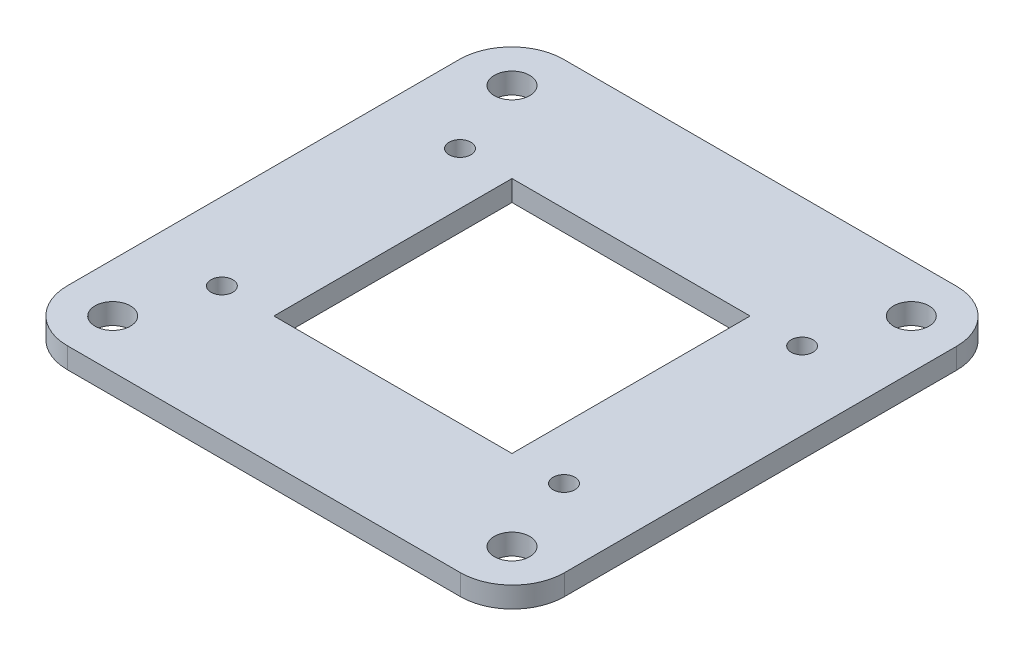
ISO-10303-21;
HEADER;
FILE_DESCRIPTION(('STEP AP214'),'2;1');
FILE_NAME('part.step','',(''),(''),'','','');
FILE_SCHEMA(('AUTOMOTIVE_DESIGN { 1 0 10303 214 1 1 1 1 }'));
ENDSEC;
DATA;
#1=APPLICATION_CONTEXT('core data for automotive mechanical design processes');
#2=APPLICATION_PROTOCOL_DEFINITION('international standard','automotive_design',2000,#1);
#3=PRODUCT_CONTEXT('',#1,'mechanical');
#4=PRODUCT('Part','Part','',(#3));
#5=PRODUCT_RELATED_PRODUCT_CATEGORY('part','',(#4));
#6=PRODUCT_DEFINITION_FORMATION('','',#4);
#7=PRODUCT_DEFINITION_CONTEXT('part definition',#1,'design');
#8=PRODUCT_DEFINITION('design','',#6,#7);
#9=PRODUCT_DEFINITION_SHAPE('','',#8);
#10=(LENGTH_UNIT() NAMED_UNIT(*) SI_UNIT(.MILLI.,.METRE.));
#11=(NAMED_UNIT(*) PLANE_ANGLE_UNIT() SI_UNIT($,.RADIAN.));
#12=(NAMED_UNIT(*) SI_UNIT($,.STERADIAN.) SOLID_ANGLE_UNIT());
#13=UNCERTAINTY_MEASURE_WITH_UNIT(LENGTH_MEASURE(1.E-05),#10,'distance_accuracy_value','');
#14=(GEOMETRIC_REPRESENTATION_CONTEXT(3) GLOBAL_UNCERTAINTY_ASSIGNED_CONTEXT((#13)) GLOBAL_UNIT_ASSIGNED_CONTEXT((#10,
#11,#12)) REPRESENTATION_CONTEXT('',''));
#15=CARTESIAN_POINT('',(0.,0.,0.));
#16=DIRECTION('',(0.,0.,1.));
#17=DIRECTION('',(1.,0.,0.));
#18=AXIS2_PLACEMENT_3D('',#15,#16,#17);
#19=CARTESIAN_POINT('',(0.,2.,-23.8566541265612));
#20=DIRECTION('',(0.,0.,-1.));
#21=DIRECTION('',(-1.,0.,0.));
#22=AXIS2_PLACEMENT_3D('',#19,#20,#21);
#23=PLANE('',#22);
#24=DIRECTION('',(1.,0.,0.));
#25=VECTOR('',#24,1.);
#26=CARTESIAN_POINT('',(0.,0.,-23.8566541265612));
#27=LINE('',#26,#25);
#28=CARTESIAN_POINT('',(-18.9,0.,-23.8566541265612));
#29=VERTEX_POINT('',#28);
#30=CARTESIAN_POINT('',(18.9,0.,-23.8566541265612));
#31=VERTEX_POINT('',#30);
#32=EDGE_CURVE('E223',#29,#31,#27,.T.);
#33=ORIENTED_EDGE('',*,*,#32,.F.);
#34=DIRECTION('',(0.,-1.,0.));
#35=VECTOR('',#34,1.);
#36=CARTESIAN_POINT('',(-18.9,2.,-23.8566541265612));
#37=LINE('',#36,#35);
#38=CARTESIAN_POINT('',(-18.9,2.,-23.8566541265612));
#39=VERTEX_POINT('',#38);
#40=EDGE_CURVE('E11',#39,#29,#37,.T.);
#41=ORIENTED_EDGE('',*,*,#40,.F.);
#42=DIRECTION('',(1.,0.,0.));
#43=VECTOR('',#42,1.);
#44=CARTESIAN_POINT('',(0.,2.,-23.8566541265612));
#45=LINE('',#44,#43);
#46=CARTESIAN_POINT('',(18.9,2.,-23.8566541265612));
#47=VERTEX_POINT('',#46);
#48=EDGE_CURVE('E322',#39,#47,#45,.T.);
#49=ORIENTED_EDGE('',*,*,#48,.T.);
#50=DIRECTION('',(0.,-1.,0.));
#51=VECTOR('',#50,1.);
#52=CARTESIAN_POINT('',(18.9,2.,-23.8566541265612));
#53=LINE('',#52,#51);
#54=EDGE_CURVE('E111',#47,#31,#53,.T.);
#55=ORIENTED_EDGE('',*,*,#54,.T.);
#56=EDGE_LOOP('',(#33,#41,#49,#55));
#57=FACE_BOUND('',#56,.T.);
#58=ADVANCED_FACE('F45',(#57),#23,.T.);
#59=CARTESIAN_POINT('',(-18.9,2.,-18.8566541265612));
#60=DIRECTION('',(0.,-1.,0.));
#61=DIRECTION('',(0.,0.,-1.));
#62=AXIS2_PLACEMENT_3D('',#59,#60,#61);
#63=CYLINDRICAL_SURFACE('',#62,5.);
#64=CARTESIAN_POINT('',(-18.9,0.,-18.8566541265612));
#65=DIRECTION('',(0.,1.,0.));
#66=DIRECTION('',(0.,0.,1.));
#67=AXIS2_PLACEMENT_3D('',#64,#65,#66);
#68=CIRCLE('',#67,5.);
#69=CARTESIAN_POINT('',(-23.9,0.,-18.8566541265612));
#70=VERTEX_POINT('',#69);
#71=EDGE_CURVE('E227',#29,#70,#68,.T.);
#72=ORIENTED_EDGE('',*,*,#71,.T.);
#73=DIRECTION('',(0.,-1.,0.));
#74=VECTOR('',#73,1.);
#75=CARTESIAN_POINT('',(-23.9,2.,-18.8566541265612));
#76=LINE('',#75,#74);
#77=CARTESIAN_POINT('',(-23.9,2.,-18.8566541265612));
#78=VERTEX_POINT('',#77);
#79=EDGE_CURVE('E56',#78,#70,#76,.T.);
#80=ORIENTED_EDGE('',*,*,#79,.F.);
#81=CARTESIAN_POINT('',(-18.9,2.,-18.8566541265612));
#82=DIRECTION('',(0.,1.,0.));
#83=DIRECTION('',(0.,0.,1.));
#84=AXIS2_PLACEMENT_3D('',#81,#82,#83);
#85=CIRCLE('',#84,5.);
#86=EDGE_CURVE('E325',#39,#78,#85,.T.);
#87=ORIENTED_EDGE('',*,*,#86,.F.);
#88=ORIENTED_EDGE('',*,*,#40,.T.);
#89=EDGE_LOOP('',(#72,#80,#87,#88));
#90=FACE_BOUND('',#89,.T.);
#91=ADVANCED_FACE('F359',(#90),#63,.T.);
#92=CARTESIAN_POINT('',(-23.9,2.,0.));
#93=DIRECTION('',(-1.,0.,0.));
#94=DIRECTION('',(0.,0.,1.));
#95=AXIS2_PLACEMENT_3D('',#92,#93,#94);
#96=PLANE('',#95);
#97=DIRECTION('',(0.,0.,-1.));
#98=VECTOR('',#97,1.);
#99=CARTESIAN_POINT('',(-23.9,0.,0.));
#100=LINE('',#99,#98);
#101=CARTESIAN_POINT('',(-23.9,0.,18.8566541265612));
#102=VERTEX_POINT('',#101);
#103=EDGE_CURVE('E231',#102,#70,#100,.T.);
#104=ORIENTED_EDGE('',*,*,#103,.F.);
#105=DIRECTION('',(0.,-1.,0.));
#106=VECTOR('',#105,1.);
#107=CARTESIAN_POINT('',(-23.9,2.,18.8566541265612));
#108=LINE('',#107,#106);
#109=CARTESIAN_POINT('',(-23.9,2.,18.8566541265612));
#110=VERTEX_POINT('',#109);
#111=EDGE_CURVE('E261',#110,#102,#108,.T.);
#112=ORIENTED_EDGE('',*,*,#111,.F.);
#113=DIRECTION('',(0.,0.,-1.));
#114=VECTOR('',#113,1.);
#115=CARTESIAN_POINT('',(-23.9,2.,0.));
#116=LINE('',#115,#114);
#117=EDGE_CURVE('E328',#110,#78,#116,.T.);
#118=ORIENTED_EDGE('',*,*,#117,.T.);
#119=ORIENTED_EDGE('',*,*,#79,.T.);
#120=EDGE_LOOP('',(#104,#112,#118,#119));
#121=FACE_BOUND('',#120,.T.);
#122=ADVANCED_FACE('F344',(#121),#96,.T.);
#123=CARTESIAN_POINT('',(-18.9,2.,18.8566541265613));
#124=DIRECTION('',(0.,-1.,0.));
#125=DIRECTION('',(0.,0.,-1.));
#126=AXIS2_PLACEMENT_3D('',#123,#124,#125);
#127=CYLINDRICAL_SURFACE('',#126,5.);
#128=CARTESIAN_POINT('',(-18.9,0.,18.8566541265613));
#129=DIRECTION('',(0.,1.,0.));
#130=DIRECTION('',(0.,0.,1.));
#131=AXIS2_PLACEMENT_3D('',#128,#129,#130);
#132=CIRCLE('',#131,5.);
#133=CARTESIAN_POINT('',(-18.9,0.,23.8566541265613));
#134=VERTEX_POINT('',#133);
#135=EDGE_CURVE('E235',#134,#102,#132,.F.);
#136=ORIENTED_EDGE('',*,*,#135,.F.);
#137=DIRECTION('',(0.,-1.,0.));
#138=VECTOR('',#137,1.);
#139=CARTESIAN_POINT('',(-18.9,2.,23.8566541265613));
#140=LINE('',#139,#138);
#141=CARTESIAN_POINT('',(-18.9,2.,23.8566541265613));
#142=VERTEX_POINT('',#141);
#143=EDGE_CURVE('E258',#142,#134,#140,.T.);
#144=ORIENTED_EDGE('',*,*,#143,.F.);
#145=CARTESIAN_POINT('',(-18.9,2.,18.8566541265613));
#146=DIRECTION('',(0.,1.,0.));
#147=DIRECTION('',(0.,0.,1.));
#148=AXIS2_PLACEMENT_3D('',#145,#146,#147);
#149=CIRCLE('',#148,5.);
#150=EDGE_CURVE('E332',#142,#110,#149,.F.);
#151=ORIENTED_EDGE('',*,*,#150,.T.);
#152=ORIENTED_EDGE('',*,*,#111,.T.);
#153=EDGE_LOOP('',(#136,#144,#151,#152));
#154=FACE_BOUND('',#153,.T.);
#155=ADVANCED_FACE('F338',(#154),#127,.T.);
#156=CARTESIAN_POINT('',(0.,2.,23.8566541265613));
#157=DIRECTION('',(0.,0.,-1.));
#158=DIRECTION('',(-1.,0.,0.));
#159=AXIS2_PLACEMENT_3D('',#156,#157,#158);
#160=PLANE('',#159);
#161=DIRECTION('',(1.,0.,0.));
#162=VECTOR('',#161,1.);
#163=CARTESIAN_POINT('',(0.,0.,23.8566541265613));
#164=LINE('',#163,#162);
#165=CARTESIAN_POINT('',(18.9,0.,23.8566541265613));
#166=VERTEX_POINT('',#165);
#167=EDGE_CURVE('E239',#134,#166,#164,.T.);
#168=ORIENTED_EDGE('',*,*,#167,.T.);
#169=DIRECTION('',(0.,-1.,0.));
#170=VECTOR('',#169,1.);
#171=CARTESIAN_POINT('',(18.9,2.,23.8566541265613));
#172=LINE('',#171,#170);
#173=CARTESIAN_POINT('',(18.9,2.,23.8566541265613));
#174=VERTEX_POINT('',#173);
#175=EDGE_CURVE('E165',#174,#166,#172,.T.);
#176=ORIENTED_EDGE('',*,*,#175,.F.);
#177=DIRECTION('',(1.,0.,0.));
#178=VECTOR('',#177,1.);
#179=CARTESIAN_POINT('',(0.,2.,23.8566541265613));
#180=LINE('',#179,#178);
#181=EDGE_CURVE('E151',#142,#174,#180,.T.);
#182=ORIENTED_EDGE('',*,*,#181,.F.);
#183=ORIENTED_EDGE('',*,*,#143,.T.);
#184=EDGE_LOOP('',(#168,#176,#182,#183));
#185=FACE_BOUND('',#184,.T.);
#186=ADVANCED_FACE('F349',(#185),#160,.F.);
#187=CARTESIAN_POINT('',(18.9,2.,18.8566541265613));
#188=DIRECTION('',(0.,-1.,0.));
#189=DIRECTION('',(0.,0.,-1.));
#190=AXIS2_PLACEMENT_3D('',#187,#188,#189);
#191=CYLINDRICAL_SURFACE('',#190,5.);
#192=CARTESIAN_POINT('',(18.9,0.,18.8566541265613));
#193=DIRECTION('',(0.,1.,0.));
#194=DIRECTION('',(0.,0.,1.));
#195=AXIS2_PLACEMENT_3D('',#192,#193,#194);
#196=CIRCLE('',#195,5.);
#197=CARTESIAN_POINT('',(23.9,0.,18.8566541265612));
#198=VERTEX_POINT('',#197);
#199=EDGE_CURVE('E160',#166,#198,#196,.T.);
#200=ORIENTED_EDGE('',*,*,#199,.T.);
#201=DIRECTION('',(0.,-1.,0.));
#202=VECTOR('',#201,1.);
#203=CARTESIAN_POINT('',(23.9,2.,18.8566541265612));
#204=LINE('',#203,#202);
#205=CARTESIAN_POINT('',(23.9,2.,18.8566541265612));
#206=VERTEX_POINT('',#205);
#207=EDGE_CURVE('E158',#206,#198,#204,.T.);
#208=ORIENTED_EDGE('',*,*,#207,.F.);
#209=CARTESIAN_POINT('',(18.9,2.,18.8566541265613));
#210=DIRECTION('',(0.,1.,0.));
#211=DIRECTION('',(0.,0.,1.));
#212=AXIS2_PLACEMENT_3D('',#209,#210,#211);
#213=CIRCLE('',#212,5.);
#214=EDGE_CURVE('E144',#174,#206,#213,.T.);
#215=ORIENTED_EDGE('',*,*,#214,.F.);
#216=ORIENTED_EDGE('',*,*,#175,.T.);
#217=EDGE_LOOP('',(#200,#208,#215,#216));
#218=FACE_BOUND('',#217,.T.);
#219=ADVANCED_FACE('F159',(#218),#191,.T.);
#220=CARTESIAN_POINT('',(23.9,2.,0.));
#221=DIRECTION('',(1.,0.,0.));
#222=DIRECTION('',(0.,0.,-1.));
#223=AXIS2_PLACEMENT_3D('',#220,#221,#222);
#224=PLANE('',#223);
#225=DIRECTION('',(0.,0.,1.));
#226=VECTOR('',#225,1.);
#227=CARTESIAN_POINT('',(23.9,0.,0.));
#228=LINE('',#227,#226);
#229=CARTESIAN_POINT('',(23.9,0.,-18.8566541265612));
#230=VERTEX_POINT('',#229);
#231=EDGE_CURVE('E245',#230,#198,#228,.T.);
#232=ORIENTED_EDGE('',*,*,#231,.F.);
#233=DIRECTION('',(0.,-1.,0.));
#234=VECTOR('',#233,1.);
#235=CARTESIAN_POINT('',(23.9,2.,-18.8566541265612));
#236=LINE('',#235,#234);
#237=CARTESIAN_POINT('',(23.9,2.,-18.8566541265612));
#238=VERTEX_POINT('',#237);
#239=EDGE_CURVE('E104',#238,#230,#236,.T.);
#240=ORIENTED_EDGE('',*,*,#239,.F.);
#241=DIRECTION('',(0.,0.,1.));
#242=VECTOR('',#241,1.);
#243=CARTESIAN_POINT('',(23.9,2.,0.));
#244=LINE('',#243,#242);
#245=EDGE_CURVE('E148',#238,#206,#244,.T.);
#246=ORIENTED_EDGE('',*,*,#245,.T.);
#247=ORIENTED_EDGE('',*,*,#207,.T.);
#248=EDGE_LOOP('',(#232,#240,#246,#247));
#249=FACE_BOUND('',#248,.T.);
#250=ADVANCED_FACE('F167',(#249),#224,.T.);
#251=CARTESIAN_POINT('',(11.45,2.,0.));
#252=DIRECTION('',(-1.,0.,0.));
#253=DIRECTION('',(0.,0.,1.));
#254=AXIS2_PLACEMENT_3D('',#251,#252,#253);
#255=PLANE('',#254);
#256=DIRECTION('',(0.,0.,-1.));
#257=VECTOR('',#256,1.);
#258=CARTESIAN_POINT('',(11.45,0.,0.));
#259=LINE('',#258,#257);
#260=CARTESIAN_POINT('',(11.45,0.,11.45));
#261=VERTEX_POINT('',#260);
#262=CARTESIAN_POINT('',(11.45,0.,-11.45));
#263=VERTEX_POINT('',#262);
#264=EDGE_CURVE('E191',#261,#263,#259,.T.);
#265=ORIENTED_EDGE('',*,*,#264,.F.);
#266=DIRECTION('',(0.,-1.,0.));
#267=VECTOR('',#266,1.);
#268=CARTESIAN_POINT('',(11.45,2.,11.45));
#269=LINE('',#268,#267);
#270=CARTESIAN_POINT('',(11.45,2.,11.45));
#271=VERTEX_POINT('',#270);
#272=EDGE_CURVE('E49',#271,#261,#269,.T.);
#273=ORIENTED_EDGE('',*,*,#272,.F.);
#274=DIRECTION('',(0.,0.,-1.));
#275=VECTOR('',#274,1.);
#276=CARTESIAN_POINT('',(11.45,2.,0.));
#277=LINE('',#276,#275);
#278=CARTESIAN_POINT('',(11.45,2.,-11.45));
#279=VERTEX_POINT('',#278);
#280=EDGE_CURVE('E303',#271,#279,#277,.T.);
#281=ORIENTED_EDGE('',*,*,#280,.T.);
#282=DIRECTION('',(0.,-1.,0.));
#283=VECTOR('',#282,1.);
#284=CARTESIAN_POINT('',(11.45,2.,-11.45));
#285=LINE('',#284,#283);
#286=EDGE_CURVE('E171',#279,#263,#285,.T.);
#287=ORIENTED_EDGE('',*,*,#286,.T.);
#288=EDGE_LOOP('',(#265,#273,#281,#287));
#289=FACE_BOUND('',#288,.T.);
#290=ADVANCED_FACE('F283',(#289),#255,.T.);
#291=CARTESIAN_POINT('',(0.,2.,11.45));
#292=DIRECTION('',(0.,0.,-1.));
#293=DIRECTION('',(-1.,0.,0.));
#294=AXIS2_PLACEMENT_3D('',#291,#292,#293);
#295=PLANE('',#294);
#296=DIRECTION('',(1.,0.,0.));
#297=VECTOR('',#296,1.);
#298=CARTESIAN_POINT('',(0.,0.,11.45));
#299=LINE('',#298,#297);
#300=CARTESIAN_POINT('',(-11.45,0.,11.45));
#301=VERTEX_POINT('',#300);
#302=EDGE_CURVE('E195',#301,#261,#299,.T.);
#303=ORIENTED_EDGE('',*,*,#302,.F.);
#304=DIRECTION('',(0.,-1.,0.));
#305=VECTOR('',#304,1.);
#306=CARTESIAN_POINT('',(-11.45,2.,11.45));
#307=LINE('',#306,#305);
#308=CARTESIAN_POINT('',(-11.45,2.,11.45));
#309=VERTEX_POINT('',#308);
#310=EDGE_CURVE('E271',#309,#301,#307,.T.);
#311=ORIENTED_EDGE('',*,*,#310,.F.);
#312=DIRECTION('',(1.,0.,0.));
#313=VECTOR('',#312,1.);
#314=CARTESIAN_POINT('',(0.,2.,11.45));
#315=LINE('',#314,#313);
#316=EDGE_CURVE('E282',#309,#271,#315,.T.);
#317=ORIENTED_EDGE('',*,*,#316,.T.);
#318=ORIENTED_EDGE('',*,*,#272,.T.);
#319=EDGE_LOOP('',(#303,#311,#317,#318));
#320=FACE_BOUND('',#319,.T.);
#321=ADVANCED_FACE('F280',(#320),#295,.T.);
#322=CARTESIAN_POINT('',(-11.45,2.,0.));
#323=DIRECTION('',(-1.,0.,0.));
#324=DIRECTION('',(0.,0.,1.));
#325=AXIS2_PLACEMENT_3D('',#322,#323,#324);
#326=PLANE('',#325);
#327=DIRECTION('',(0.,0.,-1.));
#328=VECTOR('',#327,1.);
#329=CARTESIAN_POINT('',(-11.45,0.,0.));
#330=LINE('',#329,#328);
#331=CARTESIAN_POINT('',(-11.45,0.,-11.45));
#332=VERTEX_POINT('',#331);
#333=EDGE_CURVE('E199',#301,#332,#330,.T.);
#334=ORIENTED_EDGE('',*,*,#333,.T.);
#335=DIRECTION('',(0.,-1.,0.));
#336=VECTOR('',#335,1.);
#337=CARTESIAN_POINT('',(-11.45,2.,-11.45));
#338=LINE('',#337,#336);
#339=CARTESIAN_POINT('',(-11.45,2.,-11.45));
#340=VERTEX_POINT('',#339);
#341=EDGE_CURVE('E268',#340,#332,#338,.T.);
#342=ORIENTED_EDGE('',*,*,#341,.F.);
#343=DIRECTION('',(0.,0.,-1.));
#344=VECTOR('',#343,1.);
#345=CARTESIAN_POINT('',(-11.45,2.,0.));
#346=LINE('',#345,#344);
#347=EDGE_CURVE('E291',#309,#340,#346,.T.);
#348=ORIENTED_EDGE('',*,*,#347,.F.);
#349=ORIENTED_EDGE('',*,*,#310,.T.);
#350=EDGE_LOOP('',(#334,#342,#348,#349));
#351=FACE_BOUND('',#350,.T.);
#352=ADVANCED_FACE('F289',(#351),#326,.F.);
#353=CARTESIAN_POINT('',(-16.45,2.,11.45));
#354=DIRECTION('',(0.,-1.,0.));
#355=DIRECTION('',(0.,0.,-1.));
#356=AXIS2_PLACEMENT_3D('',#353,#354,#355);
#357=CYLINDRICAL_SURFACE('',#356,1.05);
#358=CARTESIAN_POINT('',(-16.45,2.,11.45));
#359=DIRECTION('',(0.,1.,0.));
#360=DIRECTION('',(0.,0.,1.));
#361=AXIS2_PLACEMENT_3D('',#358,#359,#360);
#362=CIRCLE('',#361,1.05);
#363=CARTESIAN_POINT('',(-16.45,2.,12.5));
#364=VERTEX_POINT('',#363);
#365=EDGE_CURVE('E318',#364,#364,#362,.F.);
#366=ORIENTED_EDGE('',*,*,#365,.F.);
#367=EDGE_LOOP('',(#366));
#368=FACE_BOUND('',#367,.T.);
#369=CARTESIAN_POINT('',(-16.45,0.,11.45));
#370=DIRECTION('',(0.,1.,0.));
#371=DIRECTION('',(0.,0.,1.));
#372=AXIS2_PLACEMENT_3D('',#369,#370,#371);
#373=CIRCLE('',#372,1.05);
#374=CARTESIAN_POINT('',(-16.45,0.,12.5));
#375=VERTEX_POINT('',#374);
#376=EDGE_CURVE('E219',#375,#375,#373,.F.);
#377=ORIENTED_EDGE('',*,*,#376,.T.);
#378=EDGE_LOOP('',(#377));
#379=FACE_BOUND('',#378,.T.);
#380=ADVANCED_FACE('F368',(#368,#379),#357,.F.);
#381=CARTESIAN_POINT('',(-16.45,2.,-11.45));
#382=DIRECTION('',(0.,-1.,0.));
#383=DIRECTION('',(0.,0.,-1.));
#384=AXIS2_PLACEMENT_3D('',#381,#382,#383);
#385=CYLINDRICAL_SURFACE('',#384,1.05);
#386=CARTESIAN_POINT('',(-16.45,2.,-11.45));
#387=DIRECTION('',(0.,1.,0.));
#388=DIRECTION('',(0.,0.,1.));
#389=AXIS2_PLACEMENT_3D('',#386,#387,#388);
#390=CIRCLE('',#389,1.05);
#391=CARTESIAN_POINT('',(-16.45,2.,-10.4));
#392=VERTEX_POINT('',#391);
#393=EDGE_CURVE('E314',#392,#392,#390,.T.);
#394=ORIENTED_EDGE('',*,*,#393,.T.);
#395=EDGE_LOOP('',(#394));
#396=FACE_BOUND('',#395,.T.);
#397=CARTESIAN_POINT('',(-16.45,0.,-11.45));
#398=DIRECTION('',(0.,1.,0.));
#399=DIRECTION('',(0.,0.,1.));
#400=AXIS2_PLACEMENT_3D('',#397,#398,#399);
#401=CIRCLE('',#400,1.05);
#402=CARTESIAN_POINT('',(-16.45,0.,-10.4));
#403=VERTEX_POINT('',#402);
#404=EDGE_CURVE('E215',#403,#403,#401,.T.);
#405=ORIENTED_EDGE('',*,*,#404,.F.);
#406=EDGE_LOOP('',(#405));
#407=FACE_BOUND('',#406,.T.);
#408=ADVANCED_FACE('F371',(#396,#407),#385,.F.);
#409=CARTESIAN_POINT('',(-19.2,2.,19.2));
#410=DIRECTION('',(0.,-1.,0.));
#411=DIRECTION('',(0.,0.,-1.));
#412=AXIS2_PLACEMENT_3D('',#409,#410,#411);
#413=CYLINDRICAL_SURFACE('',#412,1.69999999999999);
#414=CARTESIAN_POINT('',(-19.2,2.,19.2));
#415=DIRECTION('',(0.,1.,0.));
#416=DIRECTION('',(0.,0.,1.));
#417=AXIS2_PLACEMENT_3D('',#414,#415,#416);
#418=CIRCLE('',#417,1.69999999999999);
#419=CARTESIAN_POINT('',(-19.2,2.,20.9));
#420=VERTEX_POINT('',#419);
#421=EDGE_CURVE('E310',#420,#420,#418,.F.);
#422=ORIENTED_EDGE('',*,*,#421,.F.);
#423=EDGE_LOOP('',(#422));
#424=FACE_BOUND('',#423,.T.);
#425=CARTESIAN_POINT('',(-19.2,0.,19.2));
#426=DIRECTION('',(0.,1.,0.));
#427=DIRECTION('',(0.,0.,1.));
#428=AXIS2_PLACEMENT_3D('',#425,#426,#427);
#429=CIRCLE('',#428,1.69999999999999);
#430=CARTESIAN_POINT('',(-19.2,0.,20.9));
#431=VERTEX_POINT('',#430);
#432=EDGE_CURVE('E211',#431,#431,#429,.F.);
#433=ORIENTED_EDGE('',*,*,#432,.T.);
#434=EDGE_LOOP('',(#433));
#435=FACE_BOUND('',#434,.T.);
#436=ADVANCED_FACE('F375',(#424,#435),#413,.F.);
#437=CARTESIAN_POINT('',(-19.2,2.,-19.2));
#438=DIRECTION('',(0.,-1.,0.));
#439=DIRECTION('',(0.,0.,-1.));
#440=AXIS2_PLACEMENT_3D('',#437,#438,#439);
#441=CYLINDRICAL_SURFACE('',#440,1.7);
#442=CARTESIAN_POINT('',(-19.2,2.,-19.2));
#443=DIRECTION('',(0.,1.,0.));
#444=DIRECTION('',(0.,0.,1.));
#445=AXIS2_PLACEMENT_3D('',#442,#443,#444);
#446=CIRCLE('',#445,1.7);
#447=CARTESIAN_POINT('',(-19.2,2.,-17.5));
#448=VERTEX_POINT('',#447);
#449=EDGE_CURVE('E297',#448,#448,#446,.T.);
#450=ORIENTED_EDGE('',*,*,#449,.T.);
#451=EDGE_LOOP('',(#450));
#452=FACE_BOUND('',#451,.T.);
#453=CARTESIAN_POINT('',(-19.2,0.,-19.2));
#454=DIRECTION('',(0.,1.,0.));
#455=DIRECTION('',(0.,0.,1.));
#456=AXIS2_PLACEMENT_3D('',#453,#454,#455);
#457=CIRCLE('',#456,1.7);
#458=CARTESIAN_POINT('',(-19.2,0.,-17.5));
#459=VERTEX_POINT('',#458);
#460=EDGE_CURVE('E207',#459,#459,#457,.T.);
#461=ORIENTED_EDGE('',*,*,#460,.F.);
#462=EDGE_LOOP('',(#461));
#463=FACE_BOUND('',#462,.T.);
#464=ADVANCED_FACE('F379',(#452,#463),#441,.F.);
#465=CARTESIAN_POINT('',(0.,2.,-11.45));
#466=DIRECTION('',(0.,0.,-1.));
#467=DIRECTION('',(-1.,0.,0.));
#468=AXIS2_PLACEMENT_3D('',#465,#466,#467);
#469=PLANE('',#468);
#470=DIRECTION('',(1.,0.,0.));
#471=VECTOR('',#470,1.);
#472=CARTESIAN_POINT('',(0.,0.,-11.45));
#473=LINE('',#472,#471);
#474=EDGE_CURVE('E203',#332,#263,#473,.T.);
#475=ORIENTED_EDGE('',*,*,#474,.T.);
#476=ORIENTED_EDGE('',*,*,#286,.F.);
#477=DIRECTION('',(1.,0.,0.));
#478=VECTOR('',#477,1.);
#479=CARTESIAN_POINT('',(0.,2.,-11.45));
#480=LINE('',#479,#478);
#481=EDGE_CURVE('E294',#340,#279,#480,.T.);
#482=ORIENTED_EDGE('',*,*,#481,.F.);
#483=ORIENTED_EDGE('',*,*,#341,.T.);
#484=EDGE_LOOP('',(#475,#476,#482,#483));
#485=FACE_BOUND('',#484,.T.);
#486=ADVANCED_FACE('F293',(#485),#469,.F.);
#487=CARTESIAN_POINT('',(19.2,2.,19.2));
#488=DIRECTION('',(0.,-1.,0.));
#489=DIRECTION('',(0.,0.,-1.));
#490=AXIS2_PLACEMENT_3D('',#487,#488,#489);
#491=CYLINDRICAL_SURFACE('',#490,1.70000000000001);
#492=CARTESIAN_POINT('',(19.2,2.,19.2));
#493=DIRECTION('',(0.,1.,0.));
#494=DIRECTION('',(0.,0.,1.));
#495=AXIS2_PLACEMENT_3D('',#492,#493,#494);
#496=CIRCLE('',#495,1.70000000000001);
#497=CARTESIAN_POINT('',(19.2,2.,20.9));
#498=VERTEX_POINT('',#497);
#499=EDGE_CURVE('E618',#498,#498,#496,.T.);
#500=ORIENTED_EDGE('',*,*,#499,.T.);
#501=EDGE_LOOP('',(#500));
#502=FACE_BOUND('',#501,.T.);
#503=CARTESIAN_POINT('',(19.2,0.,19.2));
#504=DIRECTION('',(0.,1.,0.));
#505=DIRECTION('',(0.,0.,1.));
#506=AXIS2_PLACEMENT_3D('',#503,#504,#505);
#507=CIRCLE('',#506,1.70000000000001);
#508=CARTESIAN_POINT('',(19.2,0.,20.9));
#509=VERTEX_POINT('',#508);
#510=EDGE_CURVE('E187',#509,#509,#507,.T.);
#511=ORIENTED_EDGE('',*,*,#510,.F.);
#512=EDGE_LOOP('',(#511));
#513=FACE_BOUND('',#512,.T.);
#514=ADVANCED_FACE('F386',(#502,#513),#491,.F.);
#515=CARTESIAN_POINT('',(19.2,2.,-19.2));
#516=DIRECTION('',(0.,-1.,0.));
#517=DIRECTION('',(0.,0.,-1.));
#518=AXIS2_PLACEMENT_3D('',#515,#516,#517);
#519=CYLINDRICAL_SURFACE('',#518,1.7);
#520=CARTESIAN_POINT('',(19.2,2.,-19.2));
#521=DIRECTION('',(0.,1.,0.));
#522=DIRECTION('',(0.,0.,1.));
#523=AXIS2_PLACEMENT_3D('',#520,#521,#522);
#524=CIRCLE('',#523,1.7);
#525=CARTESIAN_POINT('',(19.2,2.,-17.5));
#526=VERTEX_POINT('',#525);
#527=EDGE_CURVE('E615',#526,#526,#524,.F.);
#528=ORIENTED_EDGE('',*,*,#527,.F.);
#529=EDGE_LOOP('',(#528));
#530=FACE_BOUND('',#529,.T.);
#531=CARTESIAN_POINT('',(19.2,0.,-19.2));
#532=DIRECTION('',(0.,1.,0.));
#533=DIRECTION('',(0.,0.,1.));
#534=AXIS2_PLACEMENT_3D('',#531,#532,#533);
#535=CIRCLE('',#534,1.7);
#536=CARTESIAN_POINT('',(19.2,0.,-17.5));
#537=VERTEX_POINT('',#536);
#538=EDGE_CURVE('E183',#537,#537,#535,.F.);
#539=ORIENTED_EDGE('',*,*,#538,.T.);
#540=EDGE_LOOP('',(#539));
#541=FACE_BOUND('',#540,.T.);
#542=ADVANCED_FACE('F395',(#530,#541),#519,.F.);
#543=CARTESIAN_POINT('',(16.45,2.,11.45));
#544=DIRECTION('',(0.,-1.,0.));
#545=DIRECTION('',(0.,0.,-1.));
#546=AXIS2_PLACEMENT_3D('',#543,#544,#545);
#547=CYLINDRICAL_SURFACE('',#546,1.05000000000001);
#548=CARTESIAN_POINT('',(16.45,2.,11.45));
#549=DIRECTION('',(0.,1.,0.));
#550=DIRECTION('',(0.,0.,1.));
#551=AXIS2_PLACEMENT_3D('',#548,#549,#550);
#552=CIRCLE('',#551,1.05000000000001);
#553=CARTESIAN_POINT('',(16.45,2.,12.5));
#554=VERTEX_POINT('',#553);
#555=EDGE_CURVE('E410',#554,#554,#552,.T.);
#556=ORIENTED_EDGE('',*,*,#555,.T.);
#557=EDGE_LOOP('',(#556));
#558=FACE_BOUND('',#557,.T.);
#559=CARTESIAN_POINT('',(16.45,0.,11.45));
#560=DIRECTION('',(0.,1.,0.));
#561=DIRECTION('',(0.,0.,1.));
#562=AXIS2_PLACEMENT_3D('',#559,#560,#561);
#563=CIRCLE('',#562,1.05000000000001);
#564=CARTESIAN_POINT('',(16.45,0.,12.5));
#565=VERTEX_POINT('',#564);
#566=EDGE_CURVE('E179',#565,#565,#563,.T.);
#567=ORIENTED_EDGE('',*,*,#566,.F.);
#568=EDGE_LOOP('',(#567));
#569=FACE_BOUND('',#568,.T.);
#570=ADVANCED_FACE('F398',(#558,#569),#547,.F.);
#571=CARTESIAN_POINT('',(16.45,2.,-11.45));
#572=DIRECTION('',(0.,-1.,0.));
#573=DIRECTION('',(0.,0.,-1.));
#574=AXIS2_PLACEMENT_3D('',#571,#572,#573);
#575=CYLINDRICAL_SURFACE('',#574,1.05);
#576=CARTESIAN_POINT('',(16.45,2.,-11.45));
#577=DIRECTION('',(0.,1.,0.));
#578=DIRECTION('',(0.,0.,1.));
#579=AXIS2_PLACEMENT_3D('',#576,#577,#578);
#580=CIRCLE('',#579,1.05);
#581=CARTESIAN_POINT('',(16.45,2.,-10.4));
#582=VERTEX_POINT('',#581);
#583=EDGE_CURVE('E251',#582,#582,#580,.F.);
#584=ORIENTED_EDGE('',*,*,#583,.F.);
#585=EDGE_LOOP('',(#584));
#586=FACE_BOUND('',#585,.T.);
#587=CARTESIAN_POINT('',(16.45,0.,-11.45));
#588=DIRECTION('',(0.,1.,0.));
#589=DIRECTION('',(0.,0.,1.));
#590=AXIS2_PLACEMENT_3D('',#587,#588,#589);
#591=CIRCLE('',#590,1.05);
#592=CARTESIAN_POINT('',(16.45,0.,-10.4));
#593=VERTEX_POINT('',#592);
#594=EDGE_CURVE('E175',#593,#593,#591,.F.);
#595=ORIENTED_EDGE('',*,*,#594,.T.);
#596=EDGE_LOOP('',(#595));
#597=FACE_BOUND('',#596,.T.);
#598=ADVANCED_FACE('F47',(#586,#597),#575,.F.);
#599=CARTESIAN_POINT('',(18.9,2.,-18.8566541265612));
#600=DIRECTION('',(0.,-1.,0.));
#601=DIRECTION('',(0.,0.,-1.));
#602=AXIS2_PLACEMENT_3D('',#599,#600,#601);
#603=CYLINDRICAL_SURFACE('',#602,5.);
#604=CARTESIAN_POINT('',(18.9,0.,-18.8566541265612));
#605=DIRECTION('',(0.,1.,0.));
#606=DIRECTION('',(0.,0.,1.));
#607=AXIS2_PLACEMENT_3D('',#604,#605,#606);
#608=CIRCLE('',#607,5.);
#609=EDGE_CURVE('E248',#230,#31,#608,.T.);
#610=ORIENTED_EDGE('',*,*,#609,.T.);
#611=ORIENTED_EDGE('',*,*,#54,.F.);
#612=CARTESIAN_POINT('',(18.9,2.,-18.8566541265612));
#613=DIRECTION('',(0.,1.,0.));
#614=DIRECTION('',(0.,0.,1.));
#615=AXIS2_PLACEMENT_3D('',#612,#613,#614);
#616=CIRCLE('',#615,5.);
#617=EDGE_CURVE('E65',#238,#47,#616,.T.);
#618=ORIENTED_EDGE('',*,*,#617,.F.);
#619=ORIENTED_EDGE('',*,*,#239,.T.);
#620=EDGE_LOOP('',(#610,#611,#618,#619));
#621=FACE_BOUND('',#620,.T.);
#622=ADVANCED_FACE('F405',(#621),#603,.T.);
#623=CARTESIAN_POINT('',(0.,2.,0.));
#624=DIRECTION('',(0.,1.,0.));
#625=DIRECTION('',(0.,0.,1.));
#626=AXIS2_PLACEMENT_3D('',#623,#624,#625);
#627=PLANE('',#626);
#628=ORIENTED_EDGE('',*,*,#583,.T.);
#629=EDGE_LOOP('',(#628));
#630=FACE_BOUND('',#629,.T.);
#631=ORIENTED_EDGE('',*,*,#555,.F.);
#632=EDGE_LOOP('',(#631));
#633=FACE_BOUND('',#632,.T.);
#634=ORIENTED_EDGE('',*,*,#527,.T.);
#635=EDGE_LOOP('',(#634));
#636=FACE_BOUND('',#635,.T.);
#637=ORIENTED_EDGE('',*,*,#499,.F.);
#638=EDGE_LOOP('',(#637));
#639=FACE_BOUND('',#638,.T.);
#640=ORIENTED_EDGE('',*,*,#280,.F.);
#641=ORIENTED_EDGE('',*,*,#316,.F.);
#642=ORIENTED_EDGE('',*,*,#347,.T.);
#643=ORIENTED_EDGE('',*,*,#481,.T.);
#644=EDGE_LOOP('',(#640,#641,#642,#643));
#645=FACE_BOUND('',#644,.T.);
#646=ORIENTED_EDGE('',*,*,#449,.F.);
#647=EDGE_LOOP('',(#646));
#648=FACE_BOUND('',#647,.T.);
#649=ORIENTED_EDGE('',*,*,#421,.T.);
#650=EDGE_LOOP('',(#649));
#651=FACE_BOUND('',#650,.T.);
#652=ORIENTED_EDGE('',*,*,#393,.F.);
#653=EDGE_LOOP('',(#652));
#654=FACE_BOUND('',#653,.T.);
#655=ORIENTED_EDGE('',*,*,#365,.T.);
#656=EDGE_LOOP('',(#655));
#657=FACE_BOUND('',#656,.T.);
#658=ORIENTED_EDGE('',*,*,#48,.F.);
#659=ORIENTED_EDGE('',*,*,#86,.T.);
#660=ORIENTED_EDGE('',*,*,#117,.F.);
#661=ORIENTED_EDGE('',*,*,#150,.F.);
#662=ORIENTED_EDGE('',*,*,#181,.T.);
#663=ORIENTED_EDGE('',*,*,#214,.T.);
#664=ORIENTED_EDGE('',*,*,#245,.F.);
#665=ORIENTED_EDGE('',*,*,#617,.T.);
#666=EDGE_LOOP('',(#658,#659,#660,#661,#662,#663,#664,#665));
#667=FACE_BOUND('',#666,.T.);
#668=ADVANCED_FACE('F146',(#630,#633,#636,#639,#645,#648,#651,#654,#657,#667),#627,.T.);
#669=CARTESIAN_POINT('',(0.,0.,0.));
#670=DIRECTION('',(0.,1.,0.));
#671=DIRECTION('',(0.,0.,1.));
#672=AXIS2_PLACEMENT_3D('',#669,#670,#671);
#673=PLANE('',#672);
#674=ORIENTED_EDGE('',*,*,#594,.F.);
#675=EDGE_LOOP('',(#674));
#676=FACE_BOUND('',#675,.T.);
#677=ORIENTED_EDGE('',*,*,#566,.T.);
#678=EDGE_LOOP('',(#677));
#679=FACE_BOUND('',#678,.T.);
#680=ORIENTED_EDGE('',*,*,#538,.F.);
#681=EDGE_LOOP('',(#680));
#682=FACE_BOUND('',#681,.T.);
#683=ORIENTED_EDGE('',*,*,#510,.T.);
#684=EDGE_LOOP('',(#683));
#685=FACE_BOUND('',#684,.T.);
#686=ORIENTED_EDGE('',*,*,#264,.T.);
#687=ORIENTED_EDGE('',*,*,#474,.F.);
#688=ORIENTED_EDGE('',*,*,#333,.F.);
#689=ORIENTED_EDGE('',*,*,#302,.T.);
#690=EDGE_LOOP('',(#686,#687,#688,#689));
#691=FACE_BOUND('',#690,.T.);
#692=ORIENTED_EDGE('',*,*,#460,.T.);
#693=EDGE_LOOP('',(#692));
#694=FACE_BOUND('',#693,.T.);
#695=ORIENTED_EDGE('',*,*,#432,.F.);
#696=EDGE_LOOP('',(#695));
#697=FACE_BOUND('',#696,.T.);
#698=ORIENTED_EDGE('',*,*,#404,.T.);
#699=EDGE_LOOP('',(#698));
#700=FACE_BOUND('',#699,.T.);
#701=ORIENTED_EDGE('',*,*,#376,.F.);
#702=EDGE_LOOP('',(#701));
#703=FACE_BOUND('',#702,.T.);
#704=ORIENTED_EDGE('',*,*,#32,.T.);
#705=ORIENTED_EDGE('',*,*,#609,.F.);
#706=ORIENTED_EDGE('',*,*,#231,.T.);
#707=ORIENTED_EDGE('',*,*,#199,.F.);
#708=ORIENTED_EDGE('',*,*,#167,.F.);
#709=ORIENTED_EDGE('',*,*,#135,.T.);
#710=ORIENTED_EDGE('',*,*,#103,.T.);
#711=ORIENTED_EDGE('',*,*,#71,.F.);
#712=EDGE_LOOP('',(#704,#705,#706,#707,#708,#709,#710,#711));
#713=FACE_BOUND('',#712,.T.);
#714=ADVANCED_FACE('F286',(#676,#679,#682,#685,#691,#694,#697,#700,#703,#713),#673,.F.);
#715=CLOSED_SHELL('',(#58,#91,#122,#155,#186,#219,#250,#290,#321,#352,#380,#408,#436,#464,#486,
#514,#542,#570,#598,#622,#668,#714));
#716=MANIFOLD_SOLID_BREP('B2',#715);
#717=ADVANCED_BREP_SHAPE_REPRESENTATION('',(#18,#716),#14);
#718=SHAPE_DEFINITION_REPRESENTATION(#9,#717);
ENDSEC;
END-ISO-10303-21;
